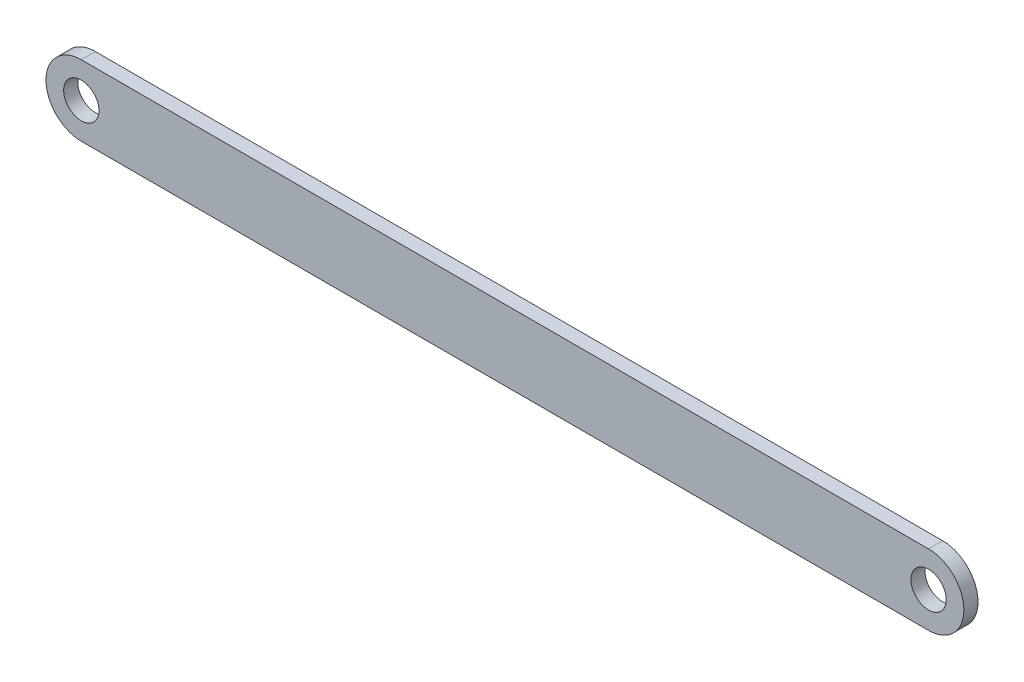
ISO-10303-21;
HEADER;
FILE_DESCRIPTION(('STEP AP214'),'2;1');
FILE_NAME('part.step','',(''),(''),'','','');
FILE_SCHEMA(('AUTOMOTIVE_DESIGN { 1 0 10303 214 1 1 1 1 }'));
ENDSEC;
DATA;
#1=APPLICATION_CONTEXT('core data for automotive mechanical design processes');
#2=APPLICATION_PROTOCOL_DEFINITION('international standard','automotive_design',2000,#1);
#3=PRODUCT_CONTEXT('',#1,'mechanical');
#4=PRODUCT('Part','Part','',(#3));
#5=PRODUCT_RELATED_PRODUCT_CATEGORY('part','',(#4));
#6=PRODUCT_DEFINITION_FORMATION('','',#4);
#7=PRODUCT_DEFINITION_CONTEXT('part definition',#1,'design');
#8=PRODUCT_DEFINITION('design','',#6,#7);
#9=PRODUCT_DEFINITION_SHAPE('','',#8);
#10=(LENGTH_UNIT() NAMED_UNIT(*) SI_UNIT(.MILLI.,.METRE.));
#11=(NAMED_UNIT(*) PLANE_ANGLE_UNIT() SI_UNIT($,.RADIAN.));
#12=(NAMED_UNIT(*) SI_UNIT($,.STERADIAN.) SOLID_ANGLE_UNIT());
#13=UNCERTAINTY_MEASURE_WITH_UNIT(LENGTH_MEASURE(1.E-05),#10,'distance_accuracy_value','');
#14=(GEOMETRIC_REPRESENTATION_CONTEXT(3) GLOBAL_UNCERTAINTY_ASSIGNED_CONTEXT((#13)) GLOBAL_UNIT_ASSIGNED_CONTEXT((#10,
#11,#12)) REPRESENTATION_CONTEXT('',''));
#15=CARTESIAN_POINT('',(0.,0.,0.));
#16=DIRECTION('',(0.,0.,1.));
#17=DIRECTION('',(1.,0.,0.));
#18=AXIS2_PLACEMENT_3D('',#15,#16,#17);
#19=CARTESIAN_POINT('',(-36.1578630634647,2.40672103374414,-2.54));
#20=DIRECTION('',(0.,0.,1.));
#21=DIRECTION('',(1.,0.,0.));
#22=AXIS2_PLACEMENT_3D('',#19,#20,#21);
#23=CYLINDRICAL_SURFACE('',#22,6.35);
#24=CARTESIAN_POINT('',(-36.1578630634647,2.40672103374414,0.));
#25=DIRECTION('',(0.,0.,1.));
#26=DIRECTION('',(1.,0.,0.));
#27=AXIS2_PLACEMENT_3D('',#24,#25,#26);
#28=CIRCLE('',#27,6.35);
#29=CARTESIAN_POINT('',(-36.1578630634647,8.75672103374414,0.));
#30=VERTEX_POINT('',#29);
#31=CARTESIAN_POINT('',(-36.1578630634647,-3.94327896625585,0.));
#32=VERTEX_POINT('',#31);
#33=EDGE_CURVE('E116',#30,#32,#28,.T.);
#34=ORIENTED_EDGE('',*,*,#33,.F.);
#35=DIRECTION('',(0.,0.,1.));
#36=VECTOR('',#35,1.);
#37=CARTESIAN_POINT('',(-36.1578630634647,8.75672103374414,-2.54));
#38=LINE('',#37,#36);
#39=CARTESIAN_POINT('',(-36.1578630634647,8.75672103374414,-2.54));
#40=VERTEX_POINT('',#39);
#41=EDGE_CURVE('E11',#40,#30,#38,.T.);
#42=ORIENTED_EDGE('',*,*,#41,.F.);
#43=CARTESIAN_POINT('',(-36.1578630634647,2.40672103374414,-2.54));
#44=DIRECTION('',(0.,0.,1.));
#45=DIRECTION('',(1.,0.,0.));
#46=AXIS2_PLACEMENT_3D('',#43,#44,#45);
#47=CIRCLE('',#46,6.35);
#48=CARTESIAN_POINT('',(-36.1578630634647,-3.94327896625585,-2.54));
#49=VERTEX_POINT('',#48);
#50=EDGE_CURVE('E107',#40,#49,#47,.T.);
#51=ORIENTED_EDGE('',*,*,#50,.T.);
#52=DIRECTION('',(0.,0.,1.));
#53=VECTOR('',#52,1.);
#54=CARTESIAN_POINT('',(-36.1578630634647,-3.94327896625585,-2.54));
#55=LINE('',#54,#53);
#56=EDGE_CURVE('E48',#49,#32,#55,.T.);
#57=ORIENTED_EDGE('',*,*,#56,.T.);
#58=EDGE_LOOP('',(#34,#42,#51,#57));
#59=FACE_BOUND('',#58,.T.);
#60=ADVANCED_FACE('F45',(#59),#23,.T.);
#61=CARTESIAN_POINT('',(116.242136936535,8.75672103374417,-2.54));
#62=DIRECTION('',(0.,1.,0.));
#63=DIRECTION('',(-1.,0.,0.));
#64=AXIS2_PLACEMENT_3D('',#61,#62,#63);
#65=PLANE('',#64);
#66=DIRECTION('',(-1.,0.,0.));
#67=VECTOR('',#66,1.);
#68=CARTESIAN_POINT('',(116.242136936535,8.75672103374417,0.));
#69=LINE('',#68,#67);
#70=CARTESIAN_POINT('',(116.242136936535,8.75672103374417,0.));
#71=VERTEX_POINT('',#70);
#72=EDGE_CURVE('E110',#71,#30,#69,.T.);
#73=ORIENTED_EDGE('',*,*,#72,.F.);
#74=DIRECTION('',(0.,0.,1.));
#75=VECTOR('',#74,1.);
#76=CARTESIAN_POINT('',(116.242136936535,8.75672103374417,-2.54));
#77=LINE('',#76,#75);
#78=CARTESIAN_POINT('',(116.242136936535,8.75672103374417,-2.54));
#79=VERTEX_POINT('',#78);
#80=EDGE_CURVE('E55',#79,#71,#77,.T.);
#81=ORIENTED_EDGE('',*,*,#80,.F.);
#82=DIRECTION('',(-1.,0.,0.));
#83=VECTOR('',#82,1.);
#84=CARTESIAN_POINT('',(116.242136936535,8.75672103374417,-2.54));
#85=LINE('',#84,#83);
#86=EDGE_CURVE('E102',#79,#40,#85,.T.);
#87=ORIENTED_EDGE('',*,*,#86,.T.);
#88=ORIENTED_EDGE('',*,*,#41,.T.);
#89=EDGE_LOOP('',(#73,#81,#87,#88));
#90=FACE_BOUND('',#89,.T.);
#91=ADVANCED_FACE('F133',(#90),#65,.T.);
#92=CARTESIAN_POINT('',(116.242136936535,2.40672103374417,-2.54));
#93=DIRECTION('',(0.,0.,1.));
#94=DIRECTION('',(1.,0.,0.));
#95=AXIS2_PLACEMENT_3D('',#92,#93,#94);
#96=CYLINDRICAL_SURFACE('',#95,6.35);
#97=CARTESIAN_POINT('',(116.242136936535,2.40672103374417,0.));
#98=DIRECTION('',(0.,0.,1.));
#99=DIRECTION('',(-1.,0.,0.));
#100=AXIS2_PLACEMENT_3D('',#97,#98,#99);
#101=CIRCLE('',#100,6.35);
#102=CARTESIAN_POINT('',(116.242136936535,-3.94327896625583,0.));
#103=VERTEX_POINT('',#102);
#104=EDGE_CURVE('E96',#103,#71,#101,.T.);
#105=ORIENTED_EDGE('',*,*,#104,.F.);
#106=DIRECTION('',(0.,0.,1.));
#107=VECTOR('',#106,1.);
#108=CARTESIAN_POINT('',(116.242136936535,-3.94327896625583,-2.54));
#109=LINE('',#108,#107);
#110=CARTESIAN_POINT('',(116.242136936535,-3.94327896625583,-2.54));
#111=VERTEX_POINT('',#110);
#112=EDGE_CURVE('E91',#111,#103,#109,.T.);
#113=ORIENTED_EDGE('',*,*,#112,.F.);
#114=CARTESIAN_POINT('',(116.242136936535,2.40672103374417,-2.54));
#115=DIRECTION('',(0.,0.,1.));
#116=DIRECTION('',(-1.,0.,0.));
#117=AXIS2_PLACEMENT_3D('',#114,#115,#116);
#118=CIRCLE('',#117,6.35);
#119=EDGE_CURVE('E94',#111,#79,#118,.T.);
#120=ORIENTED_EDGE('',*,*,#119,.T.);
#121=ORIENTED_EDGE('',*,*,#80,.T.);
#122=EDGE_LOOP('',(#105,#113,#120,#121));
#123=FACE_BOUND('',#122,.T.);
#124=ADVANCED_FACE('F93',(#123),#96,.T.);
#125=CARTESIAN_POINT('',(116.242136936535,-3.94327896625583,-2.54));
#126=DIRECTION('',(0.,-1.,0.));
#127=DIRECTION('',(1.,0.,0.));
#128=AXIS2_PLACEMENT_3D('',#125,#126,#127);
#129=PLANE('',#128);
#130=DIRECTION('',(1.,0.,0.));
#131=VECTOR('',#130,1.);
#132=CARTESIAN_POINT('',(116.242136936535,-3.94327896625583,0.));
#133=LINE('',#132,#131);
#134=EDGE_CURVE('E120',#32,#103,#133,.T.);
#135=ORIENTED_EDGE('',*,*,#134,.F.);
#136=ORIENTED_EDGE('',*,*,#56,.F.);
#137=DIRECTION('',(1.,0.,0.));
#138=VECTOR('',#137,1.);
#139=CARTESIAN_POINT('',(116.242136936535,-3.94327896625583,-2.54));
#140=LINE('',#139,#138);
#141=EDGE_CURVE('E101',#49,#111,#140,.T.);
#142=ORIENTED_EDGE('',*,*,#141,.T.);
#143=ORIENTED_EDGE('',*,*,#112,.T.);
#144=EDGE_LOOP('',(#135,#136,#142,#143));
#145=FACE_BOUND('',#144,.T.);
#146=ADVANCED_FACE('F105',(#145),#129,.T.);
#147=CARTESIAN_POINT('',(-36.1578630634647,2.40672103374414,-2.54));
#148=DIRECTION('',(0.,0.,1.));
#149=DIRECTION('',(1.,0.,0.));
#150=AXIS2_PLACEMENT_3D('',#147,#148,#149);
#151=PLANE('',#150);
#152=CARTESIAN_POINT('',(116.242136936535,2.40672103374417,-2.54));
#153=DIRECTION('',(0.,0.,1.));
#154=DIRECTION('',(1.,0.,0.));
#155=AXIS2_PLACEMENT_3D('',#152,#153,#154);
#156=CIRCLE('',#155,3.17500000000001);
#157=CARTESIAN_POINT('',(119.417136936535,2.40672103374417,-2.54));
#158=VERTEX_POINT('',#157);
#159=EDGE_CURVE('E166',#158,#158,#156,.T.);
#160=ORIENTED_EDGE('',*,*,#159,.T.);
#161=EDGE_LOOP('',(#160));
#162=FACE_BOUND('',#161,.T.);
#163=CARTESIAN_POINT('',(-36.1578630634647,2.40672103374414,-2.54));
#164=DIRECTION('',(0.,0.,1.));
#165=DIRECTION('',(1.,0.,0.));
#166=AXIS2_PLACEMENT_3D('',#163,#164,#165);
#167=CIRCLE('',#166,3.175);
#168=CARTESIAN_POINT('',(-32.9828630634647,2.40672103374414,-2.54));
#169=VERTEX_POINT('',#168);
#170=EDGE_CURVE('E121',#169,#169,#167,.T.);
#171=ORIENTED_EDGE('',*,*,#170,.T.);
#172=EDGE_LOOP('',(#171));
#173=FACE_BOUND('',#172,.T.);
#174=ORIENTED_EDGE('',*,*,#50,.F.);
#175=ORIENTED_EDGE('',*,*,#86,.F.);
#176=ORIENTED_EDGE('',*,*,#119,.F.);
#177=ORIENTED_EDGE('',*,*,#141,.F.);
#178=EDGE_LOOP('',(#174,#175,#176,#177));
#179=FACE_BOUND('',#178,.T.);
#180=ADVANCED_FACE('F100',(#162,#173,#179),#151,.F.);
#181=CARTESIAN_POINT('',(-36.1578630634647,2.40672103374414,0.));
#182=DIRECTION('',(0.,0.,1.));
#183=DIRECTION('',(1.,0.,0.));
#184=AXIS2_PLACEMENT_3D('',#181,#182,#183);
#185=PLANE('',#184);
#186=CARTESIAN_POINT('',(116.242136936535,2.40672103374417,0.));
#187=DIRECTION('',(0.,0.,1.));
#188=DIRECTION('',(1.,0.,0.));
#189=AXIS2_PLACEMENT_3D('',#186,#187,#188);
#190=CIRCLE('',#189,3.17500000000001);
#191=CARTESIAN_POINT('',(119.417136936535,2.40672103374417,0.));
#192=VERTEX_POINT('',#191);
#193=EDGE_CURVE('E169',#192,#192,#190,.T.);
#194=ORIENTED_EDGE('',*,*,#193,.F.);
#195=EDGE_LOOP('',(#194));
#196=FACE_BOUND('',#195,.T.);
#197=CARTESIAN_POINT('',(-36.1578630634647,2.40672103374414,0.));
#198=DIRECTION('',(0.,0.,1.));
#199=DIRECTION('',(1.,0.,0.));
#200=AXIS2_PLACEMENT_3D('',#197,#198,#199);
#201=CIRCLE('',#200,3.175);
#202=CARTESIAN_POINT('',(-32.9828630634647,2.40672103374414,0.));
#203=VERTEX_POINT('',#202);
#204=EDGE_CURVE('E173',#203,#203,#201,.T.);
#205=ORIENTED_EDGE('',*,*,#204,.F.);
#206=EDGE_LOOP('',(#205));
#207=FACE_BOUND('',#206,.T.);
#208=ORIENTED_EDGE('',*,*,#33,.T.);
#209=ORIENTED_EDGE('',*,*,#134,.T.);
#210=ORIENTED_EDGE('',*,*,#104,.T.);
#211=ORIENTED_EDGE('',*,*,#72,.T.);
#212=EDGE_LOOP('',(#208,#209,#210,#211));
#213=FACE_BOUND('',#212,.T.);
#214=ADVANCED_FACE('F132',(#196,#207,#213),#185,.T.);
#215=CARTESIAN_POINT('',(-36.1578630634647,2.40672103374414,-2.54));
#216=DIRECTION('',(0.,0.,1.));
#217=DIRECTION('',(1.,0.,0.));
#218=AXIS2_PLACEMENT_3D('',#215,#216,#217);
#219=CYLINDRICAL_SURFACE('',#218,3.175);
#220=ORIENTED_EDGE('',*,*,#170,.F.);
#221=EDGE_LOOP('',(#220));
#222=FACE_BOUND('',#221,.T.);
#223=ORIENTED_EDGE('',*,*,#204,.T.);
#224=EDGE_LOOP('',(#223));
#225=FACE_BOUND('',#224,.T.);
#226=ADVANCED_FACE('F151',(#222,#225),#219,.F.);
#227=CARTESIAN_POINT('',(116.242136936535,2.40672103374417,-2.54));
#228=DIRECTION('',(0.,0.,1.));
#229=DIRECTION('',(1.,0.,0.));
#230=AXIS2_PLACEMENT_3D('',#227,#228,#229);
#231=CYLINDRICAL_SURFACE('',#230,3.17500000000001);
#232=ORIENTED_EDGE('',*,*,#159,.F.);
#233=EDGE_LOOP('',(#232));
#234=FACE_BOUND('',#233,.T.);
#235=ORIENTED_EDGE('',*,*,#193,.T.);
#236=EDGE_LOOP('',(#235));
#237=FACE_BOUND('',#236,.T.);
#238=ADVANCED_FACE('F158',(#234,#237),#231,.F.);
#239=CLOSED_SHELL('',(#60,#91,#124,#146,#180,#214,#226,#238));
#240=MANIFOLD_SOLID_BREP('B2',#239);
#241=ADVANCED_BREP_SHAPE_REPRESENTATION('',(#18,#240),#14);
#242=SHAPE_DEFINITION_REPRESENTATION(#9,#241);
ENDSEC;
END-ISO-10303-21;
